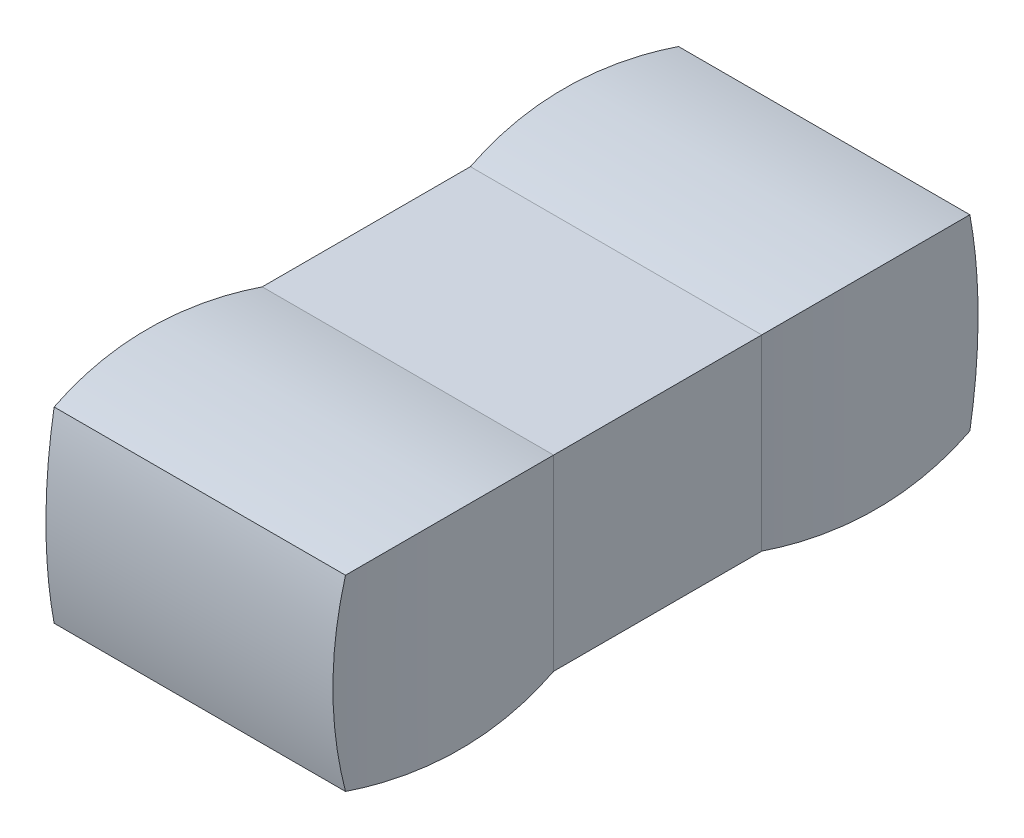
ISO-10303-21;
HEADER;
FILE_DESCRIPTION(('STEP AP214'),'2;1');
FILE_NAME('part.step','',(''),(''),'','','');
FILE_SCHEMA(('AUTOMOTIVE_DESIGN { 1 0 10303 214 1 1 1 1 }'));
ENDSEC;
DATA;
#1=APPLICATION_CONTEXT('core data for automotive mechanical design processes');
#2=APPLICATION_PROTOCOL_DEFINITION('international standard','automotive_design',2000,#1);
#3=PRODUCT_CONTEXT('',#1,'mechanical');
#4=PRODUCT('Part','Part','',(#3));
#5=PRODUCT_RELATED_PRODUCT_CATEGORY('part','',(#4));
#6=PRODUCT_DEFINITION_FORMATION('','',#4);
#7=PRODUCT_DEFINITION_CONTEXT('part definition',#1,'design');
#8=PRODUCT_DEFINITION('design','',#6,#7);
#9=PRODUCT_DEFINITION_SHAPE('','',#8);
#10=(LENGTH_UNIT() NAMED_UNIT(*) SI_UNIT(.MILLI.,.METRE.));
#11=(NAMED_UNIT(*) PLANE_ANGLE_UNIT() SI_UNIT($,.RADIAN.));
#12=(NAMED_UNIT(*) SI_UNIT($,.STERADIAN.) SOLID_ANGLE_UNIT());
#13=UNCERTAINTY_MEASURE_WITH_UNIT(LENGTH_MEASURE(1.E-05),#10,'distance_accuracy_value','');
#14=(GEOMETRIC_REPRESENTATION_CONTEXT(3) GLOBAL_UNCERTAINTY_ASSIGNED_CONTEXT((#13)) GLOBAL_UNIT_ASSIGNED_CONTEXT((#10,
#11,#12)) REPRESENTATION_CONTEXT('',''));
#15=CARTESIAN_POINT('',(0.,0.,0.));
#16=DIRECTION('',(0.,0.,1.));
#17=DIRECTION('',(1.,0.,0.));
#18=AXIS2_PLACEMENT_3D('',#15,#16,#17);
#19=CARTESIAN_POINT('',(0.4572,-1.0287,0.508));
#20=DIRECTION('',(-1.,0.,0.));
#21=DIRECTION('',(0.,0.,1.));
#22=AXIS2_PLACEMENT_3D('',#19,#20,#21);
#23=CYLINDRICAL_SURFACE('',#22,1.2827);
#24=CARTESIAN_POINT('',(0.901700000000001,-1.0287,0.508));
#25=DIRECTION('',(-0.707106781186547,-0.707106781186547,0.));
#26=DIRECTION('',(-0.707106781186547,0.707106781186547,0.));
#27=AXIS2_PLACEMENT_3D('',#24,#25,#26);
#28=ELLIPSE('',#27,1.81401173645597,1.2827);
#29=CARTESIAN_POINT('',(-0.3556,0.2286,0.762));
#30=VERTEX_POINT('',#29);
#31=CARTESIAN_POINT('',(-0.3556,0.2286,0.254));
#32=VERTEX_POINT('',#31);
#33=EDGE_CURVE('E103',#30,#32,#28,.T.);
#34=ORIENTED_EDGE('',*,*,#33,.F.);
#35=DIRECTION('',(-1.,0.,0.));
#36=VECTOR('',#35,1.);
#37=CARTESIAN_POINT('',(0.4572,0.2286,0.762));
#38=LINE('',#37,#36);
#39=CARTESIAN_POINT('',(0.3556,0.2286,0.762));
#40=VERTEX_POINT('',#39);
#41=EDGE_CURVE('E342',#40,#30,#38,.T.);
#42=ORIENTED_EDGE('',*,*,#41,.F.);
#43=CARTESIAN_POINT('',(-0.901700000000001,-1.0287,0.508));
#44=DIRECTION('',(-0.707106781186547,0.707106781186547,0.));
#45=DIRECTION('',(-0.707106781186547,-0.707106781186547,0.));
#46=AXIS2_PLACEMENT_3D('',#43,#44,#45);
#47=ELLIPSE('',#46,1.81401173645597,1.2827);
#48=CARTESIAN_POINT('',(0.3556,0.2286,0.254));
#49=VERTEX_POINT('',#48);
#50=EDGE_CURVE('E339',#40,#49,#47,.T.);
#51=ORIENTED_EDGE('',*,*,#50,.T.);
#52=DIRECTION('',(-1.,0.,0.));
#53=VECTOR('',#52,1.);
#54=CARTESIAN_POINT('',(0.3556,0.2286,0.254));
#55=LINE('',#54,#53);
#56=EDGE_CURVE('E147',#49,#32,#55,.T.);
#57=ORIENTED_EDGE('',*,*,#56,.T.);
#58=EDGE_LOOP('',(#34,#42,#51,#57));
#59=FACE_BOUND('',#58,.T.);
#60=ADVANCED_FACE('F33',(#59),#23,.T.);
#61=CARTESIAN_POINT('',(0.4572,0.,-0.254000000000001));
#62=DIRECTION('',(-1.,0.,0.));
#63=DIRECTION('',(0.,0.,1.));
#64=AXIS2_PLACEMENT_3D('',#61,#62,#63);
#65=CYLINDRICAL_SURFACE('',#64,1.0414);
#66=CARTESIAN_POINT('',(-0.3556,-0.228600000000001,0.762));
#67=CARTESIAN_POINT('',(-0.354310419271718,-0.200331622585038,0.7683587295748));
#68=CARTESIAN_POINT('',(-0.353219783837255,-0.171807614657258,0.773537488368387));
#69=CARTESIAN_POINT('',(-0.351509241497203,-0.114399931213072,0.78150421819326));
#70=CARTESIAN_POINT('',(-0.350889562894509,-0.0855160881482956,0.784291029779326));
#71=CARTESIAN_POINT('',(-0.349861724874954,0.000257649109313718,0.788947337298025));
#72=CARTESIAN_POINT('',(-0.350228233543098,0.0574039339364633,0.787365586130534));
#73=CARTESIAN_POINT('',(-0.352038418207883,0.133143431776167,0.779036258687001));
#74=CARTESIAN_POINT('',(-0.352611737942056,0.152294073745739,0.776386090591921));
#75=CARTESIAN_POINT('',(-0.353960787060495,0.190534726578794,0.770005363748573));
#76=CARTESIAN_POINT('',(-0.354737799960248,0.209623546776341,0.766267936944665));
#77=CARTESIAN_POINT('',(-0.3556,0.2286,0.762));
#78=B_SPLINE_CURVE_WITH_KNOTS('',3,(#66,#67,#68,#69,#70,#71,#72,#73,#74,#75,#76,#77),
.UNSPECIFIED.,.F.,.F.,(4,2,2,2,2,4),(0.,0.0869468243958281,0.173935770640847,0.34446599950785,
0.402470897012726,0.460850468883369),.UNSPECIFIED.);
#79=CARTESIAN_POINT('',(-0.355599999999998,-0.2286,0.761999999999999));
#80=VERTEX_POINT('',#79);
#81=EDGE_CURVE('E120',#80,#30,#78,.T.);
#82=ORIENTED_EDGE('',*,*,#81,.F.);
#83=DIRECTION('',(-1.,0.,0.));
#84=VECTOR('',#83,1.);
#85=CARTESIAN_POINT('',(0.4572,-0.2286,0.761999999999999));
#86=LINE('',#85,#84);
#87=CARTESIAN_POINT('',(0.355599999999998,-0.2286,0.761999999999999));
#88=VERTEX_POINT('',#87);
#89=EDGE_CURVE('E119',#88,#80,#86,.T.);
#90=ORIENTED_EDGE('',*,*,#89,.F.);
#91=CARTESIAN_POINT('',(0.3556,-0.228600000000001,0.762));
#92=CARTESIAN_POINT('',(0.354310419271718,-0.200331622585038,0.7683587295748));
#93=CARTESIAN_POINT('',(0.353219783837255,-0.171807614657258,0.773537488368387));
#94=CARTESIAN_POINT('',(0.351509241497203,-0.114399931213072,0.78150421819326));
#95=CARTESIAN_POINT('',(0.350889562894509,-0.0855160881482956,0.784291029779326));
#96=CARTESIAN_POINT('',(0.349861724874954,0.000257649109313705,0.788947337298025));
#97=CARTESIAN_POINT('',(0.350228233543098,0.0574039339364633,0.787365586130534));
#98=CARTESIAN_POINT('',(0.352038418207883,0.133143431776167,0.779036258687001));
#99=CARTESIAN_POINT('',(0.352611737942056,0.152294073745739,0.776386090591921));
#100=CARTESIAN_POINT('',(0.353960787060495,0.190534726578794,0.770005363748573));
#101=CARTESIAN_POINT('',(0.354737799960248,0.209623546776341,0.766267936944665));
#102=CARTESIAN_POINT('',(0.3556,0.2286,0.762));
#103=B_SPLINE_CURVE_WITH_KNOTS('',3,(#91,#92,#93,#94,#95,#96,#97,#98,#99,#100,#101,#102),
.UNSPECIFIED.,.F.,.F.,(4,2,2,2,2,4),(0.,0.0869468243958281,0.173935770640847,0.34446599950785,
0.402470897012726,0.460850468883369),.UNSPECIFIED.);
#104=EDGE_CURVE('E49',#88,#40,#103,.T.);
#105=ORIENTED_EDGE('',*,*,#104,.T.);
#106=ORIENTED_EDGE('',*,*,#41,.T.);
#107=EDGE_LOOP('',(#82,#90,#105,#106));
#108=FACE_BOUND('',#107,.T.);
#109=ADVANCED_FACE('F191',(#108),#65,.T.);
#110=CARTESIAN_POINT('',(0.4572,1.0287,0.508));
#111=DIRECTION('',(-1.,0.,0.));
#112=DIRECTION('',(0.,0.,1.));
#113=AXIS2_PLACEMENT_3D('',#110,#111,#112);
#114=CYLINDRICAL_SURFACE('',#113,1.2827);
#115=CARTESIAN_POINT('',(0.901700000000001,1.0287,0.508));
#116=DIRECTION('',(-0.707106781186547,0.707106781186547,0.));
#117=DIRECTION('',(-0.707106781186547,-0.707106781186547,0.));
#118=AXIS2_PLACEMENT_3D('',#115,#116,#117);
#119=ELLIPSE('',#118,1.81401173645597,1.2827);
#120=CARTESIAN_POINT('',(-0.3556,-0.2286,0.254));
#121=VERTEX_POINT('',#120);
#122=EDGE_CURVE('E100',#121,#80,#119,.T.);
#123=ORIENTED_EDGE('',*,*,#122,.F.);
#124=DIRECTION('',(-1.,0.,0.));
#125=VECTOR('',#124,1.);
#126=CARTESIAN_POINT('',(0.3556,-0.2286,0.254));
#127=LINE('',#126,#125);
#128=CARTESIAN_POINT('',(0.3556,-0.2286,0.254));
#129=VERTEX_POINT('',#128);
#130=EDGE_CURVE('E116',#129,#121,#127,.T.);
#131=ORIENTED_EDGE('',*,*,#130,.F.);
#132=CARTESIAN_POINT('',(-0.901700000000001,1.0287,0.508));
#133=DIRECTION('',(-0.707106781186547,-0.707106781186547,0.));
#134=DIRECTION('',(-0.707106781186547,0.707106781186547,0.));
#135=AXIS2_PLACEMENT_3D('',#132,#133,#134);
#136=ELLIPSE('',#135,1.81401173645597,1.2827);
#137=EDGE_CURVE('E11',#129,#88,#136,.T.);
#138=ORIENTED_EDGE('',*,*,#137,.T.);
#139=ORIENTED_EDGE('',*,*,#89,.T.);
#140=EDGE_LOOP('',(#123,#131,#138,#139));
#141=FACE_BOUND('',#140,.T.);
#142=ADVANCED_FACE('F114',(#141),#114,.T.);
#143=CARTESIAN_POINT('',(0.4572,-1.0287,-0.508));
#144=DIRECTION('',(-1.,0.,0.));
#145=DIRECTION('',(0.,0.,1.));
#146=AXIS2_PLACEMENT_3D('',#143,#144,#145);
#147=CYLINDRICAL_SURFACE('',#146,1.2827);
#148=CARTESIAN_POINT('',(0.901700000000001,-1.0287,-0.508));
#149=DIRECTION('',(-0.707106781186547,-0.707106781186547,0.));
#150=DIRECTION('',(-0.707106781186547,0.707106781186547,0.));
#151=AXIS2_PLACEMENT_3D('',#148,#149,#150);
#152=ELLIPSE('',#151,1.81401173645597,1.2827);
#153=CARTESIAN_POINT('',(-0.3556,0.2286,-0.254));
#154=VERTEX_POINT('',#153);
#155=CARTESIAN_POINT('',(-0.3556,0.2286,-0.762));
#156=VERTEX_POINT('',#155);
#157=EDGE_CURVE('E56',#154,#156,#152,.T.);
#158=ORIENTED_EDGE('',*,*,#157,.F.);
#159=DIRECTION('',(-1.,0.,0.));
#160=VECTOR('',#159,1.);
#161=CARTESIAN_POINT('',(0.3556,0.2286,-0.254));
#162=LINE('',#161,#160);
#163=CARTESIAN_POINT('',(0.3556,0.2286,-0.254));
#164=VERTEX_POINT('',#163);
#165=EDGE_CURVE('E138',#164,#154,#162,.T.);
#166=ORIENTED_EDGE('',*,*,#165,.F.);
#167=CARTESIAN_POINT('',(-0.901700000000001,-1.0287,-0.508));
#168=DIRECTION('',(-0.707106781186547,0.707106781186547,0.));
#169=DIRECTION('',(-0.707106781186547,-0.707106781186547,0.));
#170=AXIS2_PLACEMENT_3D('',#167,#168,#169);
#171=ELLIPSE('',#170,1.81401173645597,1.2827);
#172=CARTESIAN_POINT('',(0.3556,0.2286,-0.762));
#173=VERTEX_POINT('',#172);
#174=EDGE_CURVE('E358',#164,#173,#171,.T.);
#175=ORIENTED_EDGE('',*,*,#174,.T.);
#176=DIRECTION('',(-1.,0.,0.));
#177=VECTOR('',#176,1.);
#178=CARTESIAN_POINT('',(0.4572,0.2286,-0.762));
#179=LINE('',#178,#177);
#180=EDGE_CURVE('E362',#173,#156,#179,.T.);
#181=ORIENTED_EDGE('',*,*,#180,.T.);
#182=EDGE_LOOP('',(#158,#166,#175,#181));
#183=FACE_BOUND('',#182,.T.);
#184=ADVANCED_FACE('F248',(#183),#147,.T.);
#185=CARTESIAN_POINT('',(0.4572,1.0287,-0.508));
#186=DIRECTION('',(-1.,0.,0.));
#187=DIRECTION('',(0.,0.,1.));
#188=AXIS2_PLACEMENT_3D('',#185,#186,#187);
#189=CYLINDRICAL_SURFACE('',#188,1.2827);
#190=CARTESIAN_POINT('',(0.901700000000001,1.0287,-0.508));
#191=DIRECTION('',(-0.707106781186547,0.707106781186547,0.));
#192=DIRECTION('',(-0.707106781186547,-0.707106781186547,0.));
#193=AXIS2_PLACEMENT_3D('',#190,#191,#192);
#194=ELLIPSE('',#193,1.81401173645597,1.2827);
#195=CARTESIAN_POINT('',(-0.3556,-0.2286,-0.762));
#196=VERTEX_POINT('',#195);
#197=CARTESIAN_POINT('',(-0.3556,-0.2286,-0.254));
#198=VERTEX_POINT('',#197);
#199=EDGE_CURVE('E348',#196,#198,#194,.T.);
#200=ORIENTED_EDGE('',*,*,#199,.F.);
#201=DIRECTION('',(-1.,0.,0.));
#202=VECTOR('',#201,1.);
#203=CARTESIAN_POINT('',(0.4572,-0.2286,-0.761999999999999));
#204=LINE('',#203,#202);
#205=CARTESIAN_POINT('',(0.3556,-0.2286,-0.761999999999999));
#206=VERTEX_POINT('',#205);
#207=EDGE_CURVE('E109',#206,#196,#204,.T.);
#208=ORIENTED_EDGE('',*,*,#207,.F.);
#209=CARTESIAN_POINT('',(-0.901700000000001,1.0287,-0.508));
#210=DIRECTION('',(-0.707106781186547,-0.707106781186547,0.));
#211=DIRECTION('',(-0.707106781186547,0.707106781186547,0.));
#212=AXIS2_PLACEMENT_3D('',#209,#210,#211);
#213=ELLIPSE('',#212,1.81401173645597,1.2827);
#214=CARTESIAN_POINT('',(0.3556,-0.2286,-0.254));
#215=VERTEX_POINT('',#214);
#216=EDGE_CURVE('E353',#206,#215,#213,.T.);
#217=ORIENTED_EDGE('',*,*,#216,.T.);
#218=DIRECTION('',(-1.,0.,0.));
#219=VECTOR('',#218,1.);
#220=CARTESIAN_POINT('',(0.3556,-0.2286,-0.254));
#221=LINE('',#220,#219);
#222=EDGE_CURVE('E133',#215,#198,#221,.T.);
#223=ORIENTED_EDGE('',*,*,#222,.T.);
#224=EDGE_LOOP('',(#200,#208,#217,#223));
#225=FACE_BOUND('',#224,.T.);
#226=ADVANCED_FACE('F261',(#225),#189,.T.);
#227=CARTESIAN_POINT('',(0.4572,0.,0.254000000000001));
#228=DIRECTION('',(-1.,0.,0.));
#229=DIRECTION('',(0.,0.,1.));
#230=AXIS2_PLACEMENT_3D('',#227,#228,#229);
#231=CYLINDRICAL_SURFACE('',#230,1.0414);
#232=CARTESIAN_POINT('',(-0.3556,0.2286,-0.762));
#233=CARTESIAN_POINT('',(-0.354310419271718,0.200331622585037,-0.768358729574801));
#234=CARTESIAN_POINT('',(-0.353219783837255,0.171807614657258,-0.773537488368387));
#235=CARTESIAN_POINT('',(-0.351509241497203,0.114399931213071,-0.781504218193261));
#236=CARTESIAN_POINT('',(-0.350889562894509,0.0855160881482948,-0.784291029779326));
#237=CARTESIAN_POINT('',(-0.349861724874954,-0.000257649109314457,-0.788947337298024));
#238=CARTESIAN_POINT('',(-0.350228233543098,-0.057403933936464,-0.787365586130534));
#239=CARTESIAN_POINT('',(-0.352038418207883,-0.133143431776167,-0.779036258687001));
#240=CARTESIAN_POINT('',(-0.352611737942056,-0.152294073745739,-0.776386090591921));
#241=CARTESIAN_POINT('',(-0.353960787060495,-0.190534726578794,-0.770005363748573));
#242=CARTESIAN_POINT('',(-0.354737799960248,-0.209623546776342,-0.766267936944665));
#243=CARTESIAN_POINT('',(-0.3556,-0.2286,-0.762));
#244=B_SPLINE_CURVE_WITH_KNOTS('',3,(#232,#233,#234,#235,#236,#237,#238,#239,#240,#241,#242,
#243),.UNSPECIFIED.,.F.,.F.,(4,2,2,2,2,4),(0.,0.0869468243958281,0.173935770640847,
0.34446599950785,0.402470897012725,0.460850468883368),.UNSPECIFIED.);
#245=EDGE_CURVE('E42',#156,#196,#244,.T.);
#246=ORIENTED_EDGE('',*,*,#245,.F.);
#247=ORIENTED_EDGE('',*,*,#180,.F.);
#248=CARTESIAN_POINT('',(0.3556,0.2286,-0.762));
#249=CARTESIAN_POINT('',(0.354310419271718,0.200331622585037,-0.7683587295748));
#250=CARTESIAN_POINT('',(0.353219783837255,0.171807614657257,-0.773537488368387));
#251=CARTESIAN_POINT('',(0.351509241497203,0.114399931213071,-0.78150421819326));
#252=CARTESIAN_POINT('',(0.350889562894509,0.0855160881482948,-0.784291029779326));
#253=CARTESIAN_POINT('',(0.349861724874954,-0.00025764910931443,-0.788947337298025));
#254=CARTESIAN_POINT('',(0.350228233543098,-0.057403933936464,-0.787365586130534));
#255=CARTESIAN_POINT('',(0.352038418207883,-0.133143431776167,-0.779036258687001));
#256=CARTESIAN_POINT('',(0.352611737942056,-0.152294073745739,-0.776386090591921));
#257=CARTESIAN_POINT('',(0.353960787060495,-0.190534726578794,-0.770005363748573));
#258=CARTESIAN_POINT('',(0.354737799960248,-0.209623546776342,-0.766267936944665));
#259=CARTESIAN_POINT('',(0.3556,-0.2286,-0.762));
#260=B_SPLINE_CURVE_WITH_KNOTS('',3,(#248,#249,#250,#251,#252,#253,#254,#255,#256,#257,#258,
#259),.UNSPECIFIED.,.F.,.F.,(4,2,2,2,2,4),(0.,0.0869468243958281,0.173935770640847,
0.34446599950785,0.402470897012725,0.460850468883368),.UNSPECIFIED.);
#261=EDGE_CURVE('E132',#173,#206,#260,.T.);
#262=ORIENTED_EDGE('',*,*,#261,.T.);
#263=ORIENTED_EDGE('',*,*,#207,.T.);
#264=EDGE_LOOP('',(#246,#247,#262,#263));
#265=FACE_BOUND('',#264,.T.);
#266=ADVANCED_FACE('F177',(#265),#231,.T.);
#267=CARTESIAN_POINT('',(0.3556,-0.2286,0.254));
#268=DIRECTION('',(0.,1.,0.));
#269=DIRECTION('',(0.,0.,1.));
#270=AXIS2_PLACEMENT_3D('',#267,#268,#269);
#271=PLANE('',#270);
#272=DIRECTION('',(0.,0.,-1.));
#273=VECTOR('',#272,1.);
#274=CARTESIAN_POINT('',(-0.3556,-0.2286,0.254));
#275=LINE('',#274,#273);
#276=EDGE_CURVE('E108',#121,#198,#275,.T.);
#277=ORIENTED_EDGE('',*,*,#276,.T.);
#278=ORIENTED_EDGE('',*,*,#222,.F.);
#279=DIRECTION('',(0.,0.,-1.));
#280=VECTOR('',#279,1.);
#281=CARTESIAN_POINT('',(0.3556,-0.2286,0.254));
#282=LINE('',#281,#280);
#283=EDGE_CURVE('E130',#129,#215,#282,.T.);
#284=ORIENTED_EDGE('',*,*,#283,.F.);
#285=ORIENTED_EDGE('',*,*,#130,.T.);
#286=EDGE_LOOP('',(#277,#278,#284,#285));
#287=FACE_BOUND('',#286,.T.);
#288=ADVANCED_FACE('F35',(#287),#271,.F.);
#289=CARTESIAN_POINT('',(0.3556,0.2286,0.254));
#290=DIRECTION('',(0.,-1.,0.));
#291=DIRECTION('',(0.,0.,-1.));
#292=AXIS2_PLACEMENT_3D('',#289,#290,#291);
#293=PLANE('',#292);
#294=DIRECTION('',(0.,0.,1.));
#295=VECTOR('',#294,1.);
#296=CARTESIAN_POINT('',(-0.3556,0.2286,0.254));
#297=LINE('',#296,#295);
#298=EDGE_CURVE('E163',#154,#32,#297,.T.);
#299=ORIENTED_EDGE('',*,*,#298,.T.);
#300=ORIENTED_EDGE('',*,*,#56,.F.);
#301=DIRECTION('',(0.,0.,1.));
#302=VECTOR('',#301,1.);
#303=CARTESIAN_POINT('',(0.3556,0.2286,0.254));
#304=LINE('',#303,#302);
#305=EDGE_CURVE('E149',#164,#49,#304,.T.);
#306=ORIENTED_EDGE('',*,*,#305,.F.);
#307=ORIENTED_EDGE('',*,*,#165,.T.);
#308=EDGE_LOOP('',(#299,#300,#306,#307));
#309=FACE_BOUND('',#308,.T.);
#310=ADVANCED_FACE('F295',(#309),#293,.F.);
#311=CARTESIAN_POINT('',(0.3556,-0.2286,0.254));
#312=DIRECTION('',(1.,0.,0.));
#313=DIRECTION('',(0.,0.,-1.));
#314=AXIS2_PLACEMENT_3D('',#311,#312,#313);
#315=PLANE('',#314);
#316=DIRECTION('',(0.,-1.,0.));
#317=VECTOR('',#316,1.);
#318=CARTESIAN_POINT('',(0.3556,0.2286,0.254));
#319=LINE('',#318,#317);
#320=EDGE_CURVE('E142',#49,#129,#319,.T.);
#321=ORIENTED_EDGE('',*,*,#320,.T.);
#322=ORIENTED_EDGE('',*,*,#283,.T.);
#323=DIRECTION('',(0.,1.,0.));
#324=VECTOR('',#323,1.);
#325=CARTESIAN_POINT('',(0.3556,0.2286,-0.254));
#326=LINE('',#325,#324);
#327=EDGE_CURVE('E158',#215,#164,#326,.T.);
#328=ORIENTED_EDGE('',*,*,#327,.T.);
#329=ORIENTED_EDGE('',*,*,#305,.T.);
#330=EDGE_LOOP('',(#321,#322,#328,#329));
#331=FACE_BOUND('',#330,.T.);
#332=ADVANCED_FACE('F287',(#331),#315,.T.);
#333=CARTESIAN_POINT('',(-0.3556,-0.2286,0.254));
#334=DIRECTION('',(1.,0.,0.));
#335=DIRECTION('',(0.,0.,-1.));
#336=AXIS2_PLACEMENT_3D('',#333,#334,#335);
#337=PLANE('',#336);
#338=DIRECTION('',(0.,-1.,0.));
#339=VECTOR('',#338,1.);
#340=CARTESIAN_POINT('',(-0.3556,0.2286,0.254));
#341=LINE('',#340,#339);
#342=EDGE_CURVE('E97',#32,#121,#341,.T.);
#343=ORIENTED_EDGE('',*,*,#342,.F.);
#344=ORIENTED_EDGE('',*,*,#298,.F.);
#345=DIRECTION('',(0.,1.,0.));
#346=VECTOR('',#345,1.);
#347=CARTESIAN_POINT('',(-0.3556,0.2286,-0.254));
#348=LINE('',#347,#346);
#349=EDGE_CURVE('E125',#198,#154,#348,.T.);
#350=ORIENTED_EDGE('',*,*,#349,.F.);
#351=ORIENTED_EDGE('',*,*,#276,.F.);
#352=EDGE_LOOP('',(#343,#344,#350,#351));
#353=FACE_BOUND('',#352,.T.);
#354=ADVANCED_FACE('F124',(#353),#337,.F.);
#355=CARTESIAN_POINT('',(-0.901700000000001,-0.4572,-0.508));
#356=DIRECTION('',(0.,1.,0.));
#357=DIRECTION('',(0.,0.,1.));
#358=AXIS2_PLACEMENT_3D('',#355,#356,#357);
#359=CYLINDRICAL_SURFACE('',#358,1.2827);
#360=ORIENTED_EDGE('',*,*,#327,.F.);
#361=ORIENTED_EDGE('',*,*,#216,.F.);
#362=ORIENTED_EDGE('',*,*,#261,.F.);
#363=ORIENTED_EDGE('',*,*,#174,.F.);
#364=EDGE_LOOP('',(#360,#361,#362,#363));
#365=FACE_BOUND('',#364,.T.);
#366=ADVANCED_FACE('F180',(#365),#359,.T.);
#367=CARTESIAN_POINT('',(0.901700000000001,-0.4572,-0.508));
#368=DIRECTION('',(0.,1.,0.));
#369=DIRECTION('',(0.,0.,1.));
#370=AXIS2_PLACEMENT_3D('',#367,#368,#369);
#371=CYLINDRICAL_SURFACE('',#370,1.2827);
#372=ORIENTED_EDGE('',*,*,#157,.T.);
#373=ORIENTED_EDGE('',*,*,#245,.T.);
#374=ORIENTED_EDGE('',*,*,#199,.T.);
#375=ORIENTED_EDGE('',*,*,#349,.T.);
#376=EDGE_LOOP('',(#372,#373,#374,#375));
#377=FACE_BOUND('',#376,.T.);
#378=ADVANCED_FACE('F183',(#377),#371,.T.);
#379=CARTESIAN_POINT('',(-0.901700000000001,-0.4572,0.508));
#380=DIRECTION('',(0.,1.,0.));
#381=DIRECTION('',(0.,0.,1.));
#382=AXIS2_PLACEMENT_3D('',#379,#380,#381);
#383=CYLINDRICAL_SURFACE('',#382,1.2827);
#384=ORIENTED_EDGE('',*,*,#104,.F.);
#385=ORIENTED_EDGE('',*,*,#137,.F.);
#386=ORIENTED_EDGE('',*,*,#320,.F.);
#387=ORIENTED_EDGE('',*,*,#50,.F.);
#388=EDGE_LOOP('',(#384,#385,#386,#387));
#389=FACE_BOUND('',#388,.T.);
#390=ADVANCED_FACE('F188',(#389),#383,.T.);
#391=CARTESIAN_POINT('',(0.901700000000001,-0.4572,0.508));
#392=DIRECTION('',(0.,1.,0.));
#393=DIRECTION('',(0.,0.,1.));
#394=AXIS2_PLACEMENT_3D('',#391,#392,#393);
#395=CYLINDRICAL_SURFACE('',#394,1.2827);
#396=ORIENTED_EDGE('',*,*,#33,.T.);
#397=ORIENTED_EDGE('',*,*,#342,.T.);
#398=ORIENTED_EDGE('',*,*,#122,.T.);
#399=ORIENTED_EDGE('',*,*,#81,.T.);
#400=EDGE_LOOP('',(#396,#397,#398,#399));
#401=FACE_BOUND('',#400,.T.);
#402=ADVANCED_FACE('F99',(#401),#395,.T.);
#403=CLOSED_SHELL('',(#60,#109,#142,#184,#226,#266,#288,#310,#332,#354,#366,#378,#390,#402));
#404=MANIFOLD_SOLID_BREP('B2',#403);
#405=ADVANCED_BREP_SHAPE_REPRESENTATION('',(#18,#404),#14);
#406=SHAPE_DEFINITION_REPRESENTATION(#9,#405);
ENDSEC;
END-ISO-10303-21;
